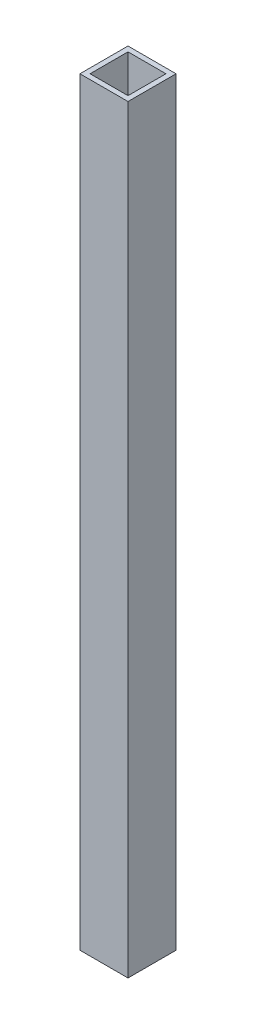
ISO-10303-21;
HEADER;
FILE_DESCRIPTION(('STEP AP214'),'2;1');
FILE_NAME('part.step','',(''),(''),'','','');
FILE_SCHEMA(('AUTOMOTIVE_DESIGN { 1 0 10303 214 1 1 1 1 }'));
ENDSEC;
DATA;
#1=APPLICATION_CONTEXT('core data for automotive mechanical design processes');
#2=APPLICATION_PROTOCOL_DEFINITION('international standard','automotive_design',2000,#1);
#3=PRODUCT_CONTEXT('',#1,'mechanical');
#4=PRODUCT('Part','Part','',(#3));
#5=PRODUCT_RELATED_PRODUCT_CATEGORY('part','',(#4));
#6=PRODUCT_DEFINITION_FORMATION('','',#4);
#7=PRODUCT_DEFINITION_CONTEXT('part definition',#1,'design');
#8=PRODUCT_DEFINITION('design','',#6,#7);
#9=PRODUCT_DEFINITION_SHAPE('','',#8);
#10=(LENGTH_UNIT() NAMED_UNIT(*) SI_UNIT(.MILLI.,.METRE.));
#11=(NAMED_UNIT(*) PLANE_ANGLE_UNIT() SI_UNIT($,.RADIAN.));
#12=(NAMED_UNIT(*) SI_UNIT($,.STERADIAN.) SOLID_ANGLE_UNIT());
#13=UNCERTAINTY_MEASURE_WITH_UNIT(LENGTH_MEASURE(1.E-05),#10,'distance_accuracy_value','');
#14=(GEOMETRIC_REPRESENTATION_CONTEXT(3) GLOBAL_UNCERTAINTY_ASSIGNED_CONTEXT((#13)) GLOBAL_UNIT_ASSIGNED_CONTEXT((#10,
#11,#12)) REPRESENTATION_CONTEXT('',''));
#15=CARTESIAN_POINT('',(0.,0.,0.));
#16=DIRECTION('',(0.,0.,1.));
#17=DIRECTION('',(1.,0.,0.));
#18=AXIS2_PLACEMENT_3D('',#15,#16,#17);
#19=CARTESIAN_POINT('',(0.,300.,0.));
#20=DIRECTION('',(0.,-1.,0.));
#21=DIRECTION('',(0.,0.,-1.));
#22=AXIS2_PLACEMENT_3D('',#19,#20,#21);
#23=PLANE('',#22);
#24=DIRECTION('',(0.,0.,-1.));
#25=VECTOR('',#24,1.);
#26=CARTESIAN_POINT('',(9.5,300.,9.5));
#27=LINE('',#26,#25);
#28=CARTESIAN_POINT('',(9.5,300.,9.5));
#29=VERTEX_POINT('',#28);
#30=CARTESIAN_POINT('',(9.5,300.,-9.5));
#31=VERTEX_POINT('',#30);
#32=EDGE_CURVE('E153',#29,#31,#27,.T.);
#33=ORIENTED_EDGE('',*,*,#32,.T.);
#34=DIRECTION('',(-1.,0.,0.));
#35=VECTOR('',#34,1.);
#36=CARTESIAN_POINT('',(-9.5,300.,-9.5));
#37=LINE('',#36,#35);
#38=CARTESIAN_POINT('',(-9.5,300.,-9.5));
#39=VERTEX_POINT('',#38);
#40=EDGE_CURVE('E157',#31,#39,#37,.T.);
#41=ORIENTED_EDGE('',*,*,#40,.T.);
#42=DIRECTION('',(0.,0.,1.));
#43=VECTOR('',#42,1.);
#44=CARTESIAN_POINT('',(-9.5,300.,9.5));
#45=LINE('',#44,#43);
#46=CARTESIAN_POINT('',(-9.5,300.,9.5));
#47=VERTEX_POINT('',#46);
#48=EDGE_CURVE('E161',#39,#47,#45,.T.);
#49=ORIENTED_EDGE('',*,*,#48,.T.);
#50=DIRECTION('',(1.,0.,0.));
#51=VECTOR('',#50,1.);
#52=CARTESIAN_POINT('',(-9.5,300.,9.5));
#53=LINE('',#52,#51);
#54=EDGE_CURVE('E164',#47,#29,#53,.T.);
#55=ORIENTED_EDGE('',*,*,#54,.T.);
#56=EDGE_LOOP('',(#33,#41,#49,#55));
#57=FACE_BOUND('',#56,.T.);
#58=DIRECTION('',(0.,0.,1.));
#59=VECTOR('',#58,1.);
#60=CARTESIAN_POINT('',(-7.5,300.,7.5));
#61=LINE('',#60,#59);
#62=CARTESIAN_POINT('',(-7.5,300.,-7.5));
#63=VERTEX_POINT('',#62);
#64=CARTESIAN_POINT('',(-7.5,300.,7.5));
#65=VERTEX_POINT('',#64);
#66=EDGE_CURVE('E105',#63,#65,#61,.T.);
#67=ORIENTED_EDGE('',*,*,#66,.F.);
#68=DIRECTION('',(-1.,0.,0.));
#69=VECTOR('',#68,1.);
#70=CARTESIAN_POINT('',(-7.5,300.,-7.5));
#71=LINE('',#70,#69);
#72=CARTESIAN_POINT('',(7.5,300.,-7.5));
#73=VERTEX_POINT('',#72);
#74=EDGE_CURVE('E131',#73,#63,#71,.T.);
#75=ORIENTED_EDGE('',*,*,#74,.F.);
#76=DIRECTION('',(0.,0.,-1.));
#77=VECTOR('',#76,1.);
#78=CARTESIAN_POINT('',(7.5,300.,7.5));
#79=LINE('',#78,#77);
#80=CARTESIAN_POINT('',(7.5,300.,7.5));
#81=VERTEX_POINT('',#80);
#82=EDGE_CURVE('E127',#81,#73,#79,.T.);
#83=ORIENTED_EDGE('',*,*,#82,.F.);
#84=DIRECTION('',(1.,0.,0.));
#85=VECTOR('',#84,1.);
#86=CARTESIAN_POINT('',(-7.5,300.,7.5));
#87=LINE('',#86,#85);
#88=EDGE_CURVE('E114',#65,#81,#87,.T.);
#89=ORIENTED_EDGE('',*,*,#88,.F.);
#90=EDGE_LOOP('',(#67,#75,#83,#89));
#91=FACE_BOUND('',#90,.T.);
#92=ADVANCED_FACE('F39',(#57,#91),#23,.F.);
#93=CARTESIAN_POINT('',(0.,0.,0.));
#94=DIRECTION('',(0.,-1.,0.));
#95=DIRECTION('',(0.,0.,-1.));
#96=AXIS2_PLACEMENT_3D('',#93,#94,#95);
#97=PLANE('',#96);
#98=DIRECTION('',(0.,0.,-1.));
#99=VECTOR('',#98,1.);
#100=CARTESIAN_POINT('',(9.5,0.,9.5));
#101=LINE('',#100,#99);
#102=CARTESIAN_POINT('',(9.5,0.,9.5));
#103=VERTEX_POINT('',#102);
#104=CARTESIAN_POINT('',(9.5,0.,-9.5));
#105=VERTEX_POINT('',#104);
#106=EDGE_CURVE('E123',#103,#105,#101,.T.);
#107=ORIENTED_EDGE('',*,*,#106,.F.);
#108=DIRECTION('',(1.,0.,0.));
#109=VECTOR('',#108,1.);
#110=CARTESIAN_POINT('',(-9.5,0.,9.5));
#111=LINE('',#110,#109);
#112=CARTESIAN_POINT('',(-9.5,0.,9.5));
#113=VERTEX_POINT('',#112);
#114=EDGE_CURVE('E158',#113,#103,#111,.T.);
#115=ORIENTED_EDGE('',*,*,#114,.F.);
#116=DIRECTION('',(0.,0.,1.));
#117=VECTOR('',#116,1.);
#118=CARTESIAN_POINT('',(-9.5,0.,9.5));
#119=LINE('',#118,#117);
#120=CARTESIAN_POINT('',(-9.5,0.,-9.5));
#121=VERTEX_POINT('',#120);
#122=EDGE_CURVE('E174',#121,#113,#119,.T.);
#123=ORIENTED_EDGE('',*,*,#122,.F.);
#124=DIRECTION('',(-1.,0.,0.));
#125=VECTOR('',#124,1.);
#126=CARTESIAN_POINT('',(-9.5,0.,-9.5));
#127=LINE('',#126,#125);
#128=EDGE_CURVE('E171',#105,#121,#127,.T.);
#129=ORIENTED_EDGE('',*,*,#128,.F.);
#130=EDGE_LOOP('',(#107,#115,#123,#129));
#131=FACE_BOUND('',#130,.T.);
#132=DIRECTION('',(-1.,0.,0.));
#133=VECTOR('',#132,1.);
#134=CARTESIAN_POINT('',(-7.5,0.,-7.5));
#135=LINE('',#134,#133);
#136=CARTESIAN_POINT('',(7.5,0.,-7.5));
#137=VERTEX_POINT('',#136);
#138=CARTESIAN_POINT('',(-7.5,0.,-7.5));
#139=VERTEX_POINT('',#138);
#140=EDGE_CURVE('E115',#137,#139,#135,.T.);
#141=ORIENTED_EDGE('',*,*,#140,.T.);
#142=DIRECTION('',(0.,0.,1.));
#143=VECTOR('',#142,1.);
#144=CARTESIAN_POINT('',(-7.5,0.,7.5));
#145=LINE('',#144,#143);
#146=CARTESIAN_POINT('',(-7.5,0.,7.5));
#147=VERTEX_POINT('',#146);
#148=EDGE_CURVE('E63',#139,#147,#145,.T.);
#149=ORIENTED_EDGE('',*,*,#148,.T.);
#150=DIRECTION('',(1.,0.,0.));
#151=VECTOR('',#150,1.);
#152=CARTESIAN_POINT('',(-7.5,0.,7.5));
#153=LINE('',#152,#151);
#154=CARTESIAN_POINT('',(7.5,0.,7.5));
#155=VERTEX_POINT('',#154);
#156=EDGE_CURVE('E121',#147,#155,#153,.T.);
#157=ORIENTED_EDGE('',*,*,#156,.T.);
#158=DIRECTION('',(0.,0.,-1.));
#159=VECTOR('',#158,1.);
#160=CARTESIAN_POINT('',(7.5,0.,7.5));
#161=LINE('',#160,#159);
#162=EDGE_CURVE('E140',#155,#137,#161,.T.);
#163=ORIENTED_EDGE('',*,*,#162,.T.);
#164=EDGE_LOOP('',(#141,#149,#157,#163));
#165=FACE_BOUND('',#164,.T.);
#166=ADVANCED_FACE('F197',(#131,#165),#97,.T.);
#167=CARTESIAN_POINT('',(9.5,300.,9.5));
#168=DIRECTION('',(-1.,0.,0.));
#169=DIRECTION('',(0.,0.,1.));
#170=AXIS2_PLACEMENT_3D('',#167,#168,#169);
#171=PLANE('',#170);
#172=ORIENTED_EDGE('',*,*,#106,.T.);
#173=DIRECTION('',(0.,-1.,0.));
#174=VECTOR('',#173,1.);
#175=CARTESIAN_POINT('',(9.5,300.,-9.5));
#176=LINE('',#175,#174);
#177=EDGE_CURVE('E11',#31,#105,#176,.T.);
#178=ORIENTED_EDGE('',*,*,#177,.F.);
#179=ORIENTED_EDGE('',*,*,#32,.F.);
#180=DIRECTION('',(0.,-1.,0.));
#181=VECTOR('',#180,1.);
#182=CARTESIAN_POINT('',(9.5,300.,9.5));
#183=LINE('',#182,#181);
#184=EDGE_CURVE('E167',#29,#103,#183,.T.);
#185=ORIENTED_EDGE('',*,*,#184,.T.);
#186=EDGE_LOOP('',(#172,#178,#179,#185));
#187=FACE_BOUND('',#186,.T.);
#188=ADVANCED_FACE('F41',(#187),#171,.F.);
#189=CARTESIAN_POINT('',(-9.5,300.,-9.5));
#190=DIRECTION('',(0.,0.,1.));
#191=DIRECTION('',(1.,0.,0.));
#192=AXIS2_PLACEMENT_3D('',#189,#190,#191);
#193=PLANE('',#192);
#194=ORIENTED_EDGE('',*,*,#128,.T.);
#195=DIRECTION('',(0.,-1.,0.));
#196=VECTOR('',#195,1.);
#197=CARTESIAN_POINT('',(-9.5,300.,-9.5));
#198=LINE('',#197,#196);
#199=EDGE_CURVE('E48',#39,#121,#198,.T.);
#200=ORIENTED_EDGE('',*,*,#199,.F.);
#201=ORIENTED_EDGE('',*,*,#40,.F.);
#202=ORIENTED_EDGE('',*,*,#177,.T.);
#203=EDGE_LOOP('',(#194,#200,#201,#202));
#204=FACE_BOUND('',#203,.T.);
#205=ADVANCED_FACE('F207',(#204),#193,.F.);
#206=CARTESIAN_POINT('',(-9.5,300.,9.5));
#207=DIRECTION('',(1.,0.,0.));
#208=DIRECTION('',(0.,0.,-1.));
#209=AXIS2_PLACEMENT_3D('',#206,#207,#208);
#210=PLANE('',#209);
#211=ORIENTED_EDGE('',*,*,#122,.T.);
#212=DIRECTION('',(0.,-1.,0.));
#213=VECTOR('',#212,1.);
#214=CARTESIAN_POINT('',(-9.5,300.,9.5));
#215=LINE('',#214,#213);
#216=EDGE_CURVE('E182',#47,#113,#215,.T.);
#217=ORIENTED_EDGE('',*,*,#216,.F.);
#218=ORIENTED_EDGE('',*,*,#48,.F.);
#219=ORIENTED_EDGE('',*,*,#199,.T.);
#220=EDGE_LOOP('',(#211,#217,#218,#219));
#221=FACE_BOUND('',#220,.T.);
#222=ADVANCED_FACE('F191',(#221),#210,.F.);
#223=CARTESIAN_POINT('',(-9.5,300.,9.5));
#224=DIRECTION('',(0.,0.,-1.));
#225=DIRECTION('',(-1.,0.,0.));
#226=AXIS2_PLACEMENT_3D('',#223,#224,#225);
#227=PLANE('',#226);
#228=ORIENTED_EDGE('',*,*,#114,.T.);
#229=ORIENTED_EDGE('',*,*,#184,.F.);
#230=ORIENTED_EDGE('',*,*,#54,.F.);
#231=ORIENTED_EDGE('',*,*,#216,.T.);
#232=EDGE_LOOP('',(#228,#229,#230,#231));
#233=FACE_BOUND('',#232,.T.);
#234=ADVANCED_FACE('F201',(#233),#227,.F.);
#235=CARTESIAN_POINT('',(-7.5,300.,7.5));
#236=DIRECTION('',(1.,0.,0.));
#237=DIRECTION('',(0.,0.,-1.));
#238=AXIS2_PLACEMENT_3D('',#235,#236,#237);
#239=PLANE('',#238);
#240=ORIENTED_EDGE('',*,*,#148,.F.);
#241=DIRECTION('',(0.,-1.,0.));
#242=VECTOR('',#241,1.);
#243=CARTESIAN_POINT('',(-7.5,300.,-7.5));
#244=LINE('',#243,#242);
#245=EDGE_CURVE('E109',#63,#139,#244,.T.);
#246=ORIENTED_EDGE('',*,*,#245,.F.);
#247=ORIENTED_EDGE('',*,*,#66,.T.);
#248=DIRECTION('',(0.,-1.,0.));
#249=VECTOR('',#248,1.);
#250=CARTESIAN_POINT('',(-7.5,300.,7.5));
#251=LINE('',#250,#249);
#252=EDGE_CURVE('E108',#65,#147,#251,.T.);
#253=ORIENTED_EDGE('',*,*,#252,.T.);
#254=EDGE_LOOP('',(#240,#246,#247,#253));
#255=FACE_BOUND('',#254,.T.);
#256=ADVANCED_FACE('F107',(#255),#239,.T.);
#257=CARTESIAN_POINT('',(-7.5,300.,7.5));
#258=DIRECTION('',(0.,0.,-1.));
#259=DIRECTION('',(-1.,0.,0.));
#260=AXIS2_PLACEMENT_3D('',#257,#258,#259);
#261=PLANE('',#260);
#262=ORIENTED_EDGE('',*,*,#156,.F.);
#263=ORIENTED_EDGE('',*,*,#252,.F.);
#264=ORIENTED_EDGE('',*,*,#88,.T.);
#265=DIRECTION('',(0.,-1.,0.));
#266=VECTOR('',#265,1.);
#267=CARTESIAN_POINT('',(7.5,300.,7.5));
#268=LINE('',#267,#266);
#269=EDGE_CURVE('E124',#81,#155,#268,.T.);
#270=ORIENTED_EDGE('',*,*,#269,.T.);
#271=EDGE_LOOP('',(#262,#263,#264,#270));
#272=FACE_BOUND('',#271,.T.);
#273=ADVANCED_FACE('F118',(#272),#261,.T.);
#274=CARTESIAN_POINT('',(7.5,300.,7.5));
#275=DIRECTION('',(-1.,0.,0.));
#276=DIRECTION('',(0.,0.,1.));
#277=AXIS2_PLACEMENT_3D('',#274,#275,#276);
#278=PLANE('',#277);
#279=ORIENTED_EDGE('',*,*,#162,.F.);
#280=ORIENTED_EDGE('',*,*,#269,.F.);
#281=ORIENTED_EDGE('',*,*,#82,.T.);
#282=DIRECTION('',(0.,-1.,0.));
#283=VECTOR('',#282,1.);
#284=CARTESIAN_POINT('',(7.5,300.,-7.5));
#285=LINE('',#284,#283);
#286=EDGE_CURVE('E55',#73,#137,#285,.T.);
#287=ORIENTED_EDGE('',*,*,#286,.T.);
#288=EDGE_LOOP('',(#279,#280,#281,#287));
#289=FACE_BOUND('',#288,.T.);
#290=ADVANCED_FACE('F230',(#289),#278,.T.);
#291=CARTESIAN_POINT('',(-7.5,300.,-7.5));
#292=DIRECTION('',(0.,0.,1.));
#293=DIRECTION('',(1.,0.,0.));
#294=AXIS2_PLACEMENT_3D('',#291,#292,#293);
#295=PLANE('',#294);
#296=ORIENTED_EDGE('',*,*,#140,.F.);
#297=ORIENTED_EDGE('',*,*,#286,.F.);
#298=ORIENTED_EDGE('',*,*,#74,.T.);
#299=ORIENTED_EDGE('',*,*,#245,.T.);
#300=EDGE_LOOP('',(#296,#297,#298,#299));
#301=FACE_BOUND('',#300,.T.);
#302=ADVANCED_FACE('F234',(#301),#295,.T.);
#303=CLOSED_SHELL('',(#92,#166,#188,#205,#222,#234,#256,#273,#290,#302));
#304=MANIFOLD_SOLID_BREP('B2',#303);
#305=ADVANCED_BREP_SHAPE_REPRESENTATION('',(#18,#304),#14);
#306=SHAPE_DEFINITION_REPRESENTATION(#9,#305);
ENDSEC;
END-ISO-10303-21;
